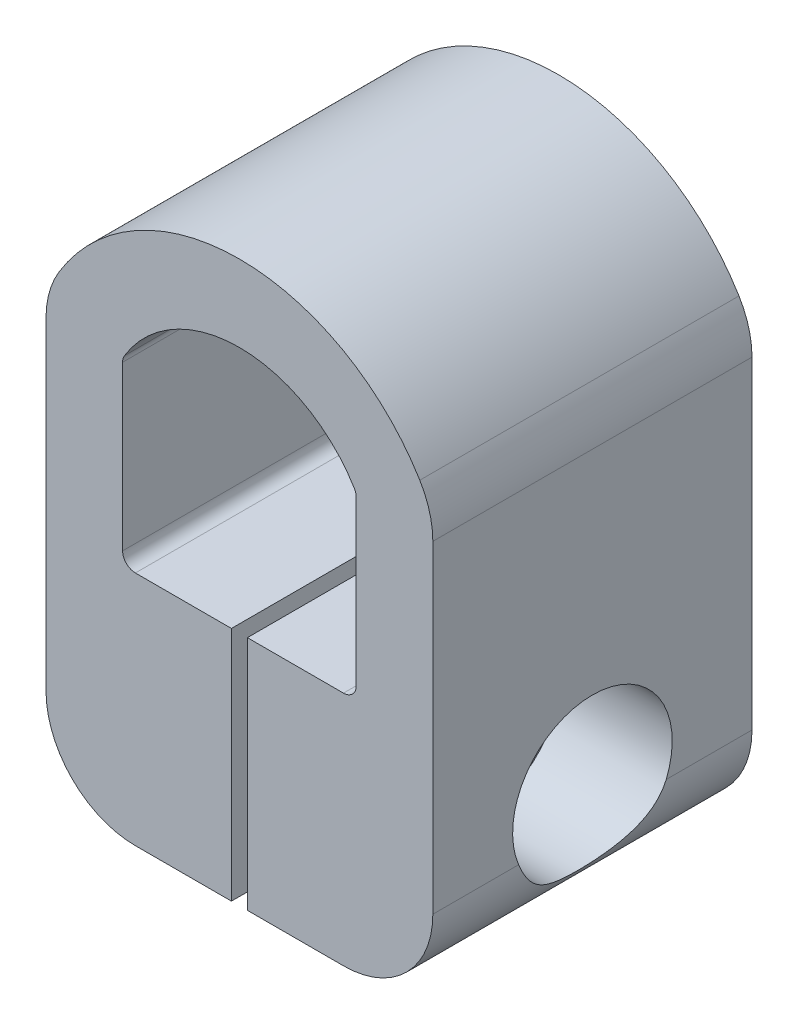
ISO-10303-21;
HEADER;
FILE_DESCRIPTION(('STEP AP214'),'2;1');
FILE_NAME('part.step','',(''),(''),'','','');
FILE_SCHEMA(('AUTOMOTIVE_DESIGN { 1 0 10303 214 1 1 1 1 }'));
ENDSEC;
DATA;
#1=APPLICATION_CONTEXT('core data for automotive mechanical design processes');
#2=APPLICATION_PROTOCOL_DEFINITION('international standard','automotive_design',2000,#1);
#3=PRODUCT_CONTEXT('',#1,'mechanical');
#4=PRODUCT('Part','Part','',(#3));
#5=PRODUCT_RELATED_PRODUCT_CATEGORY('part','',(#4));
#6=PRODUCT_DEFINITION_FORMATION('','',#4);
#7=PRODUCT_DEFINITION_CONTEXT('part definition',#1,'design');
#8=PRODUCT_DEFINITION('design','',#6,#7);
#9=PRODUCT_DEFINITION_SHAPE('','',#8);
#10=(LENGTH_UNIT() NAMED_UNIT(*) SI_UNIT(.MILLI.,.METRE.));
#11=(NAMED_UNIT(*) PLANE_ANGLE_UNIT() SI_UNIT($,.RADIAN.));
#12=(NAMED_UNIT(*) SI_UNIT($,.STERADIAN.) SOLID_ANGLE_UNIT());
#13=UNCERTAINTY_MEASURE_WITH_UNIT(LENGTH_MEASURE(1.E-05),#10,'distance_accuracy_value','');
#14=(GEOMETRIC_REPRESENTATION_CONTEXT(3) GLOBAL_UNCERTAINTY_ASSIGNED_CONTEXT((#13)) GLOBAL_UNIT_ASSIGNED_CONTEXT((#10,
#11,#12)) REPRESENTATION_CONTEXT('',''));
#15=CARTESIAN_POINT('',(0.,0.,0.));
#16=DIRECTION('',(0.,0.,1.));
#17=DIRECTION('',(1.,0.,0.));
#18=AXIS2_PLACEMENT_3D('',#15,#16,#17);
#19=CARTESIAN_POINT('',(0.,-19.05,25.4));
#20=DIRECTION('',(0.,1.,0.));
#21=DIRECTION('',(0.,0.,1.));
#22=AXIS2_PLACEMENT_3D('',#19,#20,#21);
#23=PLANE('',#22);
#24=DIRECTION('',(0.,0.,1.));
#25=VECTOR('',#24,1.);
#26=CARTESIAN_POINT('',(0.635000000000003,-19.05,0.));
#27=LINE('',#26,#25);
#28=CARTESIAN_POINT('',(0.635000000000003,-19.05,0.));
#29=VERTEX_POINT('',#28);
#30=CARTESIAN_POINT('',(0.635000000000003,-19.05,25.4));
#31=VERTEX_POINT('',#30);
#32=EDGE_CURVE('E358',#29,#31,#27,.T.);
#33=ORIENTED_EDGE('',*,*,#32,.F.);
#34=DIRECTION('',(1.,0.,0.));
#35=VECTOR('',#34,1.);
#36=CARTESIAN_POINT('',(0.,-19.05,0.));
#37=LINE('',#36,#35);
#38=CARTESIAN_POINT('',(8.2804,-19.05,0.));
#39=VERTEX_POINT('',#38);
#40=EDGE_CURVE('E209',#29,#39,#37,.T.);
#41=ORIENTED_EDGE('',*,*,#40,.T.);
#42=DIRECTION('',(0.,0.,-1.));
#43=VECTOR('',#42,1.);
#44=CARTESIAN_POINT('',(8.2804,-19.05,25.4));
#45=LINE('',#44,#43);
#46=CARTESIAN_POINT('',(8.2804,-19.05,25.4));
#47=VERTEX_POINT('',#46);
#48=EDGE_CURVE('E44',#47,#39,#45,.T.);
#49=ORIENTED_EDGE('',*,*,#48,.F.);
#50=DIRECTION('',(1.,0.,0.));
#51=VECTOR('',#50,1.);
#52=CARTESIAN_POINT('',(0.,-19.05,25.4));
#53=LINE('',#52,#51);
#54=EDGE_CURVE('E333',#31,#47,#53,.T.);
#55=ORIENTED_EDGE('',*,*,#54,.F.);
#56=EDGE_LOOP('',(#33,#41,#49,#55));
#57=FACE_BOUND('',#56,.T.);
#58=ADVANCED_FACE('F35',(#57),#23,.F.);
#59=CARTESIAN_POINT('',(0.,-0.254,25.4));
#60=DIRECTION('',(0.,1.,0.));
#61=DIRECTION('',(-1.,0.,0.));
#62=AXIS2_PLACEMENT_3D('',#59,#60,#61);
#63=PLANE('',#62);
#64=DIRECTION('',(1.,0.,0.));
#65=VECTOR('',#64,1.);
#66=CARTESIAN_POINT('',(0.,-0.254,0.));
#67=LINE('',#66,#65);
#68=CARTESIAN_POINT('',(0.635000000000003,-0.254,0.));
#69=VERTEX_POINT('',#68);
#70=CARTESIAN_POINT('',(8.2804,-0.254,0.));
#71=VERTEX_POINT('',#70);
#72=EDGE_CURVE('E200',#69,#71,#67,.T.);
#73=ORIENTED_EDGE('',*,*,#72,.F.);
#74=DIRECTION('',(0.,0.,1.));
#75=VECTOR('',#74,1.);
#76=CARTESIAN_POINT('',(0.635000000000003,-0.254,0.));
#77=LINE('',#76,#75);
#78=CARTESIAN_POINT('',(0.635000000000003,-0.254,25.4));
#79=VERTEX_POINT('',#78);
#80=EDGE_CURVE('E59',#69,#79,#77,.T.);
#81=ORIENTED_EDGE('',*,*,#80,.T.);
#82=DIRECTION('',(1.,0.,0.));
#83=VECTOR('',#82,1.);
#84=CARTESIAN_POINT('',(0.,-0.254,25.4));
#85=LINE('',#84,#83);
#86=CARTESIAN_POINT('',(8.2804,-0.254,25.4));
#87=VERTEX_POINT('',#86);
#88=EDGE_CURVE('E325',#79,#87,#85,.T.);
#89=ORIENTED_EDGE('',*,*,#88,.T.);
#90=DIRECTION('',(0.,0.,-1.));
#91=VECTOR('',#90,1.);
#92=CARTESIAN_POINT('',(8.2804,-0.254,25.4));
#93=LINE('',#92,#91);
#94=EDGE_CURVE('E260',#87,#71,#93,.T.);
#95=ORIENTED_EDGE('',*,*,#94,.T.);
#96=EDGE_LOOP('',(#73,#81,#89,#95));
#97=FACE_BOUND('',#96,.T.);
#98=ADVANCED_FACE('F389',(#97),#63,.T.);
#99=CARTESIAN_POINT('',(0.,0.,25.4));
#100=DIRECTION('',(0.,0.,1.));
#101=DIRECTION('',(1.,0.,0.));
#102=AXIS2_PLACEMENT_3D('',#99,#100,#101);
#103=PLANE('',#102);
#104=ORIENTED_EDGE('',*,*,#88,.F.);
#105=DIRECTION('',(0.,-1.,0.));
#106=VECTOR('',#105,1.);
#107=CARTESIAN_POINT('',(0.635000000000002,0.,25.4));
#108=LINE('',#107,#106);
#109=EDGE_CURVE('E455',#79,#31,#108,.T.);
#110=ORIENTED_EDGE('',*,*,#109,.T.);
#111=ORIENTED_EDGE('',*,*,#54,.T.);
#112=CARTESIAN_POINT('',(8.2804,-11.938,25.4));
#113=DIRECTION('',(0.,0.,1.));
#114=DIRECTION('',(1.,0.,0.));
#115=AXIS2_PLACEMENT_3D('',#112,#113,#114);
#116=CIRCLE('',#115,7.112);
#117=CARTESIAN_POINT('',(15.3924,-11.938,25.4));
#118=VERTEX_POINT('',#117);
#119=EDGE_CURVE('E337',#47,#118,#116,.T.);
#120=ORIENTED_EDGE('',*,*,#119,.T.);
#121=DIRECTION('',(0.,1.,0.));
#122=VECTOR('',#121,1.);
#123=CARTESIAN_POINT('',(15.3924,0.,25.4));
#124=LINE('',#123,#122);
#125=CARTESIAN_POINT('',(15.3924,13.7607257458803,25.4));
#126=VERTEX_POINT('',#125);
#127=EDGE_CURVE('E339',#118,#126,#124,.T.);
#128=ORIENTED_EDGE('',*,*,#127,.T.);
#129=CARTESIAN_POINT('',(8.2804,13.7607257458803,25.4));
#130=DIRECTION('',(0.,0.,1.));
#131=DIRECTION('',(1.,0.,0.));
#132=AXIS2_PLACEMENT_3D('',#129,#130,#131);
#133=CIRCLE('',#132,7.112);
#134=CARTESIAN_POINT('',(14.3559710368718,17.4577489505579,25.4));
#135=VERTEX_POINT('',#134);
#136=EDGE_CURVE('E341',#126,#135,#133,.T.);
#137=ORIENTED_EDGE('',*,*,#136,.T.);
#138=CARTESIAN_POINT('',(0.,8.72205024390244,25.4));
#139=DIRECTION('',(0.,0.,1.));
#140=DIRECTION('',(1.,0.,0.));
#141=AXIS2_PLACEMENT_3D('',#138,#139,#140);
#142=CIRCLE('',#141,16.8049497560976);
#143=CARTESIAN_POINT('',(-14.3559710368718,17.4577489505579,25.4));
#144=VERTEX_POINT('',#143);
#145=EDGE_CURVE('E343',#135,#144,#142,.T.);
#146=ORIENTED_EDGE('',*,*,#145,.T.);
#147=CARTESIAN_POINT('',(-8.28039999999999,13.7607257458803,25.4));
#148=DIRECTION('',(0.,0.,1.));
#149=DIRECTION('',(1.,0.,0.));
#150=AXIS2_PLACEMENT_3D('',#147,#148,#149);
#151=CIRCLE('',#150,7.112);
#152=CARTESIAN_POINT('',(-15.3924,13.7607257458803,25.4));
#153=VERTEX_POINT('',#152);
#154=EDGE_CURVE('E345',#144,#153,#151,.T.);
#155=ORIENTED_EDGE('',*,*,#154,.T.);
#156=DIRECTION('',(0.,-1.,0.));
#157=VECTOR('',#156,1.);
#158=CARTESIAN_POINT('',(-15.3924,0.,25.4));
#159=LINE('',#158,#157);
#160=CARTESIAN_POINT('',(-15.3924,-11.938,25.4));
#161=VERTEX_POINT('',#160);
#162=EDGE_CURVE('E347',#153,#161,#159,.T.);
#163=ORIENTED_EDGE('',*,*,#162,.T.);
#164=CARTESIAN_POINT('',(-8.2804,-11.938,25.4));
#165=DIRECTION('',(0.,0.,1.));
#166=DIRECTION('',(1.,0.,0.));
#167=AXIS2_PLACEMENT_3D('',#164,#165,#166);
#168=CIRCLE('',#167,7.112);
#169=CARTESIAN_POINT('',(-8.2804,-19.05,25.4));
#170=VERTEX_POINT('',#169);
#171=EDGE_CURVE('E256',#161,#170,#168,.T.);
#172=ORIENTED_EDGE('',*,*,#171,.T.);
#173=CARTESIAN_POINT('',(-0.634999999999997,-19.05,25.4));
#174=VERTEX_POINT('',#173);
#175=EDGE_CURVE('E334',#170,#174,#53,.T.);
#176=ORIENTED_EDGE('',*,*,#175,.T.);
#177=DIRECTION('',(0.,-1.,0.));
#178=VECTOR('',#177,1.);
#179=CARTESIAN_POINT('',(-0.634999999999998,0.,25.4));
#180=LINE('',#179,#178);
#181=CARTESIAN_POINT('',(-0.634999999999998,-0.254,25.4));
#182=VERTEX_POINT('',#181);
#183=EDGE_CURVE('E458',#182,#174,#180,.T.);
#184=ORIENTED_EDGE('',*,*,#183,.F.);
#185=CARTESIAN_POINT('',(-8.2804,-0.254,25.4));
#186=VERTEX_POINT('',#185);
#187=EDGE_CURVE('E194',#186,#182,#85,.T.);
#188=ORIENTED_EDGE('',*,*,#187,.F.);
#189=CARTESIAN_POINT('',(-8.2804,0.762,25.4));
#190=DIRECTION('',(0.,0.,1.));
#191=DIRECTION('',(1.,0.,0.));
#192=AXIS2_PLACEMENT_3D('',#189,#190,#191);
#193=CIRCLE('',#192,1.016);
#194=CARTESIAN_POINT('',(-9.2964,0.762000000000001,25.4));
#195=VERTEX_POINT('',#194);
#196=EDGE_CURVE('E327',#195,#186,#193,.T.);
#197=ORIENTED_EDGE('',*,*,#196,.F.);
#198=DIRECTION('',(0.,-1.,0.));
#199=VECTOR('',#198,1.);
#200=CARTESIAN_POINT('',(-9.2964,0.,25.4));
#201=LINE('',#200,#199);
#202=CARTESIAN_POINT('',(-9.2964,13.7607257458803,25.4));
#203=VERTEX_POINT('',#202);
#204=EDGE_CURVE('E330',#203,#195,#201,.T.);
#205=ORIENTED_EDGE('',*,*,#204,.F.);
#206=CARTESIAN_POINT('',(-8.28039999999999,13.7607257458803,25.4));
#207=DIRECTION('',(0.,0.,1.));
#208=DIRECTION('',(1.,0.,0.));
#209=AXIS2_PLACEMENT_3D('',#206,#207,#208);
#210=CIRCLE('',#209,1.016);
#211=CARTESIAN_POINT('',(-9.14833871955311,14.2888719179771,25.4));
#212=VERTEX_POINT('',#211);
#213=EDGE_CURVE('E227',#212,#203,#210,.T.);
#214=ORIENTED_EDGE('',*,*,#213,.F.);
#215=CARTESIAN_POINT('',(0.,8.72205024390244,25.4));
#216=DIRECTION('',(0.,0.,1.));
#217=DIRECTION('',(1.,0.,0.));
#218=AXIS2_PLACEMENT_3D('',#215,#216,#217);
#219=CIRCLE('',#218,10.7089497560976);
#220=CARTESIAN_POINT('',(9.14833871955311,14.2888719179771,25.4));
#221=VERTEX_POINT('',#220);
#222=EDGE_CURVE('E278',#221,#212,#219,.T.);
#223=ORIENTED_EDGE('',*,*,#222,.F.);
#224=CARTESIAN_POINT('',(8.2804,13.7607257458803,25.4));
#225=DIRECTION('',(0.,0.,1.));
#226=DIRECTION('',(1.,0.,0.));
#227=AXIS2_PLACEMENT_3D('',#224,#225,#226);
#228=CIRCLE('',#227,1.016);
#229=CARTESIAN_POINT('',(9.2964,13.7607257458803,25.4));
#230=VERTEX_POINT('',#229);
#231=EDGE_CURVE('E313',#230,#221,#228,.T.);
#232=ORIENTED_EDGE('',*,*,#231,.F.);
#233=DIRECTION('',(0.,1.,0.));
#234=VECTOR('',#233,1.);
#235=CARTESIAN_POINT('',(9.2964,0.,25.4));
#236=LINE('',#235,#234);
#237=CARTESIAN_POINT('',(9.2964,0.762,25.4));
#238=VERTEX_POINT('',#237);
#239=EDGE_CURVE('E308',#238,#230,#236,.T.);
#240=ORIENTED_EDGE('',*,*,#239,.F.);
#241=CARTESIAN_POINT('',(8.2804,0.762,25.4));
#242=DIRECTION('',(0.,0.,1.));
#243=DIRECTION('',(1.,0.,0.));
#244=AXIS2_PLACEMENT_3D('',#241,#242,#243);
#245=CIRCLE('',#244,1.016);
#246=EDGE_CURVE('E303',#87,#238,#245,.T.);
#247=ORIENTED_EDGE('',*,*,#246,.F.);
#248=EDGE_LOOP('',(#104,#110,#111,#120,#128,#137,#146,#155,#163,#172,#176,#184,#188,#197,#205,
#214,#223,#232,#240,#247));
#249=FACE_BOUND('',#248,.T.);
#250=ADVANCED_FACE('F316',(#249),#103,.T.);
#251=CARTESIAN_POINT('',(0.,0.,0.));
#252=DIRECTION('',(0.,0.,1.));
#253=DIRECTION('',(1.,0.,0.));
#254=AXIS2_PLACEMENT_3D('',#251,#252,#253);
#255=PLANE('',#254);
#256=DIRECTION('',(0.,-1.,0.));
#257=VECTOR('',#256,1.);
#258=CARTESIAN_POINT('',(0.635000000000002,0.,0.));
#259=LINE('',#258,#257);
#260=EDGE_CURVE('E185',#69,#29,#259,.T.);
#261=ORIENTED_EDGE('',*,*,#260,.F.);
#262=ORIENTED_EDGE('',*,*,#72,.T.);
#263=CARTESIAN_POINT('',(8.2804,0.762,0.));
#264=DIRECTION('',(0.,0.,1.));
#265=DIRECTION('',(1.,0.,0.));
#266=AXIS2_PLACEMENT_3D('',#263,#264,#265);
#267=CIRCLE('',#266,1.016);
#268=CARTESIAN_POINT('',(9.2964,0.762,0.));
#269=VERTEX_POINT('',#268);
#270=EDGE_CURVE('E204',#71,#269,#267,.T.);
#271=ORIENTED_EDGE('',*,*,#270,.T.);
#272=DIRECTION('',(0.,1.,0.));
#273=VECTOR('',#272,1.);
#274=CARTESIAN_POINT('',(9.2964,0.,0.));
#275=LINE('',#274,#273);
#276=CARTESIAN_POINT('',(9.2964,13.7607257458803,0.));
#277=VERTEX_POINT('',#276);
#278=EDGE_CURVE('E291',#269,#277,#275,.T.);
#279=ORIENTED_EDGE('',*,*,#278,.T.);
#280=CARTESIAN_POINT('',(8.2804,13.7607257458803,0.));
#281=DIRECTION('',(0.,0.,1.));
#282=DIRECTION('',(1.,0.,0.));
#283=AXIS2_PLACEMENT_3D('',#280,#281,#282);
#284=CIRCLE('',#283,1.016);
#285=CARTESIAN_POINT('',(9.14833871955311,14.2888719179771,0.));
#286=VERTEX_POINT('',#285);
#287=EDGE_CURVE('E289',#277,#286,#284,.T.);
#288=ORIENTED_EDGE('',*,*,#287,.T.);
#289=CARTESIAN_POINT('',(0.,8.72205024390244,0.));
#290=DIRECTION('',(0.,0.,1.));
#291=DIRECTION('',(1.,0.,0.));
#292=AXIS2_PLACEMENT_3D('',#289,#290,#291);
#293=CIRCLE('',#292,10.7089497560976);
#294=CARTESIAN_POINT('',(-9.14833871955311,14.2888719179771,0.));
#295=VERTEX_POINT('',#294);
#296=EDGE_CURVE('E275',#286,#295,#293,.T.);
#297=ORIENTED_EDGE('',*,*,#296,.T.);
#298=CARTESIAN_POINT('',(-8.28039999999999,13.7607257458803,0.));
#299=DIRECTION('',(0.,0.,1.));
#300=DIRECTION('',(1.,0.,0.));
#301=AXIS2_PLACEMENT_3D('',#298,#299,#300);
#302=CIRCLE('',#301,1.016);
#303=CARTESIAN_POINT('',(-9.2964,13.7607257458803,0.));
#304=VERTEX_POINT('',#303);
#305=EDGE_CURVE('E283',#295,#304,#302,.T.);
#306=ORIENTED_EDGE('',*,*,#305,.T.);
#307=DIRECTION('',(0.,-1.,0.));
#308=VECTOR('',#307,1.);
#309=CARTESIAN_POINT('',(-9.2964,0.,0.));
#310=LINE('',#309,#308);
#311=CARTESIAN_POINT('',(-9.2964,0.762000000000001,0.));
#312=VERTEX_POINT('',#311);
#313=EDGE_CURVE('E202',#304,#312,#310,.T.);
#314=ORIENTED_EDGE('',*,*,#313,.T.);
#315=CARTESIAN_POINT('',(-8.2804,0.762,0.));
#316=DIRECTION('',(0.,0.,1.));
#317=DIRECTION('',(1.,0.,0.));
#318=AXIS2_PLACEMENT_3D('',#315,#316,#317);
#319=CIRCLE('',#318,1.016);
#320=CARTESIAN_POINT('',(-8.2804,-0.254,0.));
#321=VERTEX_POINT('',#320);
#322=EDGE_CURVE('E199',#312,#321,#319,.T.);
#323=ORIENTED_EDGE('',*,*,#322,.T.);
#324=CARTESIAN_POINT('',(-0.634999999999998,-0.254,0.));
#325=VERTEX_POINT('',#324);
#326=EDGE_CURVE('E191',#321,#325,#67,.T.);
#327=ORIENTED_EDGE('',*,*,#326,.T.);
#328=DIRECTION('',(0.,-1.,0.));
#329=VECTOR('',#328,1.);
#330=CARTESIAN_POINT('',(-0.634999999999998,0.,0.));
#331=LINE('',#330,#329);
#332=CARTESIAN_POINT('',(-0.634999999999997,-19.05,0.));
#333=VERTEX_POINT('',#332);
#334=EDGE_CURVE('E176',#325,#333,#331,.T.);
#335=ORIENTED_EDGE('',*,*,#334,.T.);
#336=CARTESIAN_POINT('',(-8.2804,-19.05,0.));
#337=VERTEX_POINT('',#336);
#338=EDGE_CURVE('E210',#337,#333,#37,.T.);
#339=ORIENTED_EDGE('',*,*,#338,.F.);
#340=CARTESIAN_POINT('',(-8.2804,-11.938,0.));
#341=DIRECTION('',(0.,0.,1.));
#342=DIRECTION('',(1.,0.,0.));
#343=AXIS2_PLACEMENT_3D('',#340,#341,#342);
#344=CIRCLE('',#343,7.112);
#345=CARTESIAN_POINT('',(-15.3924,-11.938,0.));
#346=VERTEX_POINT('',#345);
#347=EDGE_CURVE('E225',#346,#337,#344,.T.);
#348=ORIENTED_EDGE('',*,*,#347,.F.);
#349=DIRECTION('',(0.,-1.,0.));
#350=VECTOR('',#349,1.);
#351=CARTESIAN_POINT('',(-15.3924,0.,0.));
#352=LINE('',#351,#350);
#353=CARTESIAN_POINT('',(-15.3924,13.7607257458803,0.));
#354=VERTEX_POINT('',#353);
#355=EDGE_CURVE('E223',#354,#346,#352,.T.);
#356=ORIENTED_EDGE('',*,*,#355,.F.);
#357=CARTESIAN_POINT('',(-8.28039999999999,13.7607257458803,0.));
#358=DIRECTION('',(0.,0.,1.));
#359=DIRECTION('',(1.,0.,0.));
#360=AXIS2_PLACEMENT_3D('',#357,#358,#359);
#361=CIRCLE('',#360,7.112);
#362=CARTESIAN_POINT('',(-14.3559710368718,17.4577489505579,0.));
#363=VERTEX_POINT('',#362);
#364=EDGE_CURVE('E221',#363,#354,#361,.T.);
#365=ORIENTED_EDGE('',*,*,#364,.F.);
#366=CARTESIAN_POINT('',(0.,8.72205024390244,0.));
#367=DIRECTION('',(0.,0.,1.));
#368=DIRECTION('',(1.,0.,0.));
#369=AXIS2_PLACEMENT_3D('',#366,#367,#368);
#370=CIRCLE('',#369,16.8049497560976);
#371=CARTESIAN_POINT('',(14.3559710368718,17.4577489505579,0.));
#372=VERTEX_POINT('',#371);
#373=EDGE_CURVE('E219',#372,#363,#370,.T.);
#374=ORIENTED_EDGE('',*,*,#373,.F.);
#375=CARTESIAN_POINT('',(8.2804,13.7607257458803,0.));
#376=DIRECTION('',(0.,0.,1.));
#377=DIRECTION('',(1.,0.,0.));
#378=AXIS2_PLACEMENT_3D('',#375,#376,#377);
#379=CIRCLE('',#378,7.112);
#380=CARTESIAN_POINT('',(15.3924,13.7607257458803,0.));
#381=VERTEX_POINT('',#380);
#382=EDGE_CURVE('E217',#381,#372,#379,.T.);
#383=ORIENTED_EDGE('',*,*,#382,.F.);
#384=DIRECTION('',(0.,1.,0.));
#385=VECTOR('',#384,1.);
#386=CARTESIAN_POINT('',(15.3924,0.,0.));
#387=LINE('',#386,#385);
#388=CARTESIAN_POINT('',(15.3924,-11.938,0.));
#389=VERTEX_POINT('',#388);
#390=EDGE_CURVE('E215',#389,#381,#387,.T.);
#391=ORIENTED_EDGE('',*,*,#390,.F.);
#392=CARTESIAN_POINT('',(8.2804,-11.938,0.));
#393=DIRECTION('',(0.,0.,1.));
#394=DIRECTION('',(1.,0.,0.));
#395=AXIS2_PLACEMENT_3D('',#392,#393,#394);
#396=CIRCLE('',#395,7.112);
#397=EDGE_CURVE('E212',#39,#389,#396,.T.);
#398=ORIENTED_EDGE('',*,*,#397,.F.);
#399=ORIENTED_EDGE('',*,*,#40,.F.);
#400=EDGE_LOOP('',(#261,#262,#271,#279,#288,#297,#306,#314,#323,#327,#335,#339,#348,#356,#365,
#374,#383,#391,#398,#399));
#401=FACE_BOUND('',#400,.T.);
#402=ADVANCED_FACE('F196',(#401),#255,.F.);
#403=CARTESIAN_POINT('',(0.152400000000002,-9.525,12.7));
#404=DIRECTION('',(1.,0.,0.));
#405=DIRECTION('',(0.,1.,0.));
#406=AXIS2_PLACEMENT_3D('',#403,#404,#405);
#407=CYLINDRICAL_SURFACE('',#406,3.175);
#408=CARTESIAN_POINT('',(6.5024,-9.525,12.7));
#409=DIRECTION('',(1.,0.,0.));
#410=DIRECTION('',(0.,1.,0.));
#411=AXIS2_PLACEMENT_3D('',#408,#409,#410);
#412=CIRCLE('',#411,3.175);
#413=CARTESIAN_POINT('',(6.5024,-6.35,12.7));
#414=VERTEX_POINT('',#413);
#415=EDGE_CURVE('E364',#414,#414,#412,.T.);
#416=ORIENTED_EDGE('',*,*,#415,.T.);
#417=EDGE_LOOP('',(#416));
#418=FACE_BOUND('',#417,.T.);
#419=CARTESIAN_POINT('',(0.635000000000003,-9.525,12.7));
#420=DIRECTION('',(-1.,0.,0.));
#421=DIRECTION('',(0.,-1.,0.));
#422=AXIS2_PLACEMENT_3D('',#419,#420,#421);
#423=CIRCLE('',#422,3.175);
#424=CARTESIAN_POINT('',(0.635000000000003,-12.7,12.7));
#425=VERTEX_POINT('',#424);
#426=EDGE_CURVE('E39',#425,#425,#423,.F.);
#427=ORIENTED_EDGE('',*,*,#426,.F.);
#428=EDGE_LOOP('',(#427));
#429=FACE_BOUND('',#428,.T.);
#430=ADVANCED_FACE('F392',(#418,#429),#407,.F.);
#431=ORIENTED_EDGE('',*,*,#338,.T.);
#432=DIRECTION('',(0.,0.,1.));
#433=VECTOR('',#432,1.);
#434=CARTESIAN_POINT('',(-0.634999999999997,-19.05,0.));
#435=LINE('',#434,#433);
#436=EDGE_CURVE('E51',#333,#174,#435,.T.);
#437=ORIENTED_EDGE('',*,*,#436,.T.);
#438=ORIENTED_EDGE('',*,*,#175,.F.);
#439=DIRECTION('',(0.,0.,-1.));
#440=VECTOR('',#439,1.);
#441=CARTESIAN_POINT('',(-8.2804,-19.05,25.4));
#442=LINE('',#441,#440);
#443=EDGE_CURVE('E228',#170,#337,#442,.T.);
#444=ORIENTED_EDGE('',*,*,#443,.T.);
#445=EDGE_LOOP('',(#431,#437,#438,#444));
#446=FACE_BOUND('',#445,.T.);
#447=ADVANCED_FACE('F357',(#446),#23,.F.);
#448=CARTESIAN_POINT('',(8.2804,-11.938,25.4));
#449=DIRECTION('',(0.,0.,-1.));
#450=DIRECTION('',(-1.,0.,0.));
#451=AXIS2_PLACEMENT_3D('',#448,#449,#450);
#452=CYLINDRICAL_SURFACE('',#451,7.112);
#453=DIRECTION('',(0.,0.,-1.));
#454=VECTOR('',#453,1.);
#455=CARTESIAN_POINT('',(15.3924,-11.938,25.4));
#456=LINE('',#455,#454);
#457=CARTESIAN_POINT('',(15.3924,-11.938,6.82633581143763));
#458=VERTEX_POINT('',#457);
#459=EDGE_CURVE('E247',#458,#389,#456,.T.);
#460=ORIENTED_EDGE('',*,*,#459,.F.);
#461=CARTESIAN_POINT('',(15.3924,-11.938,6.82633581143763));
#462=CARTESIAN_POINT('',(15.3924278064319,-12.0918523638487,6.88950421975895));
#463=CARTESIAN_POINT('',(15.387409338751,-12.2431194439231,6.95874616505039));
#464=CARTESIAN_POINT('',(15.3684892961368,-12.5391647591403,7.10851726617109));
#465=CARTESIAN_POINT('',(15.3545984124505,-12.6839505798002,7.18903274636085));
#466=CARTESIAN_POINT('',(15.3192687286385,-12.965044763054,7.36001054665285));
#467=CARTESIAN_POINT('',(15.2978866522844,-13.1014080190008,7.45039469519593));
#468=CARTESIAN_POINT('',(15.2488555240133,-13.3660389616524,7.6407993458642));
#469=CARTESIAN_POINT('',(15.2212046787058,-13.4943043182316,7.7408226008606));
#470=CARTESIAN_POINT('',(15.1311086240926,-13.864824878252,8.05323981684156));
#471=CARTESIAN_POINT('',(15.0613062525486,-14.0942966907045,8.27889665982908));
#472=CARTESIAN_POINT('',(14.9125179077233,-14.515936057594,8.76096271313372));
#473=CARTESIAN_POINT('',(14.8335074558927,-14.7080003785046,9.01745395263454));
#474=CARTESIAN_POINT('',(14.7118624217837,-14.9757558772031,9.43753959889212));
#475=CARTESIAN_POINT('',(14.6685558267893,-15.0654088367384,9.59220397132654));
#476=CARTESIAN_POINT('',(14.5844587927273,-15.231639679938,9.90916062202048));
#477=CARTESIAN_POINT('',(14.5436689424184,-15.3082145115017,10.0714546696122));
#478=CARTESIAN_POINT('',(14.4666391003129,-15.4476056523254,10.402718057865));
#479=CARTESIAN_POINT('',(14.4303950092508,-15.5104343961316,10.5716812010256));
#480=CARTESIAN_POINT('',(14.364373439256,-15.621748622879,10.9154102234089));
#481=CARTESIAN_POINT('',(14.3345920630634,-15.6702427565553,11.0901725317908));
#482=CARTESIAN_POINT('',(14.2838525606623,-15.7513111034274,11.4402153697173));
#483=CARTESIAN_POINT('',(14.2627035795267,-15.7842325717654,11.6153872611309));
#484=CARTESIAN_POINT('',(14.2295759232313,-15.8352790922104,11.9687447562726));
#485=CARTESIAN_POINT('',(14.2175968313884,-15.8534048166437,12.1469302226867));
#486=CARTESIAN_POINT('',(14.20362483192,-15.8745104887286,12.5044286484672));
#487=CARTESIAN_POINT('',(14.2016227580822,-15.8775043385635,12.6837404213214));
#488=CARTESIAN_POINT('',(14.2077212003933,-15.8683229861276,13.0417876763356));
#489=CARTESIAN_POINT('',(14.2158207084702,-15.8561492974784,13.2205232142158));
#490=CARTESIAN_POINT('',(14.2395753335872,-15.819900671989,13.5482773118067));
#491=CARTESIAN_POINT('',(14.2538755016888,-15.7979461441725,13.6976351648427));
#492=CARTESIAN_POINT('',(14.2886205920009,-15.7436350289891,13.993739926699));
#493=CARTESIAN_POINT('',(14.3090675212578,-15.7112750437818,14.1404859661051));
#494=CARTESIAN_POINT('',(14.3783446795227,-15.5990684880449,14.5755775802769));
#495=CARTESIAN_POINT('',(14.4351206011978,-15.5040824783747,14.8588898893711));
#496=CARTESIAN_POINT('',(14.5659529133129,-15.2684274437081,15.4271391125094));
#497=CARTESIAN_POINT('',(14.6409779352909,-15.1248952331144,15.7106412754559));
#498=CARTESIAN_POINT('',(14.7947102138734,-14.797544302959,16.2528988058821));
#499=CARTESIAN_POINT('',(14.8734221213599,-14.6136735591548,16.5116215908618));
#500=CARTESIAN_POINT('',(14.9918632421895,-14.2943414828497,16.8963467667113));
#501=CARTESIAN_POINT('',(15.0339817672683,-14.1713668678904,17.0321452984248));
#502=CARTESIAN_POINT('',(15.1138997788655,-13.9133610934083,17.2933065475826));
#503=CARTESIAN_POINT('',(15.1516981485015,-13.7783268321267,17.4186665641117));
#504=CARTESIAN_POINT('',(15.2208586595244,-13.4973128608743,17.6575337188103));
#505=CARTESIAN_POINT('',(15.2522392811446,-13.3513662794531,17.7710744141363));
#506=CARTESIAN_POINT('',(15.3067383144226,-13.0491534837355,17.9855591727313));
#507=CARTESIAN_POINT('',(15.329862918987,-12.8928951090911,18.0865126406339));
#508=CARTESIAN_POINT('',(15.3622157505983,-12.6049232542598,18.2550214009993));
#509=CARTESIAN_POINT('',(15.3733398037189,-12.4749207817561,18.3251438368952));
#510=CARTESIAN_POINT('',(15.3884420300292,-12.2099617922263,18.4563366661853));
#511=CARTESIAN_POINT('',(15.3924170439522,-12.0750031118472,18.5174030466421));
#512=CARTESIAN_POINT('',(15.3924,-11.938,18.5736641885624));
#513=B_SPLINE_CURVE_WITH_KNOTS('',3,(#461,#462,#463,#464,#465,#466,#467,#468,#469,#470,#471,
#472,#473,#474,#475,#476,#477,#478,#479,#480,#481,#482,#483,#484,#485,#486,#487,#488,#489,#490,
#491,#492,#493,#494,#495,#496,#497,#498,#499,#500,#501,#502,#503,#504,#505,#506,#507,#508,#509,
#510,#511,#512),.UNSPECIFIED.,.F.,.F.,(4,2,2,2,2,2,2,2,2,2,2,2,2,2,2,2,2,2,2,2,2,2,2,2,2,4),(0.,
0.498615840775297,0.996631980878007,1.49095583102689,1.98542127787313,2.96912640659501,
3.95550895395703,4.50678684953187,5.05819322398872,5.60909872139863,6.15967107314651,
6.69730828846828,7.23492107191482,7.77203984176881,8.30910501496504,8.76349970848244,
9.21804293283392,10.1267902677042,11.1028649780523,12.080206001903,12.6435477633205,
13.2070348366578,13.7688757362031,14.3302943043965,14.7741650714247,15.2182319433907),.UNSPECIFIED.);
#514=CARTESIAN_POINT('',(15.3924,-11.938,18.5736641885624));
#515=VERTEX_POINT('',#514);
#516=EDGE_CURVE('E285',#458,#515,#513,.T.);
#517=ORIENTED_EDGE('',*,*,#516,.T.);
#518=EDGE_CURVE('E248',#118,#515,#456,.T.);
#519=ORIENTED_EDGE('',*,*,#518,.F.);
#520=ORIENTED_EDGE('',*,*,#119,.F.);
#521=ORIENTED_EDGE('',*,*,#48,.T.);
#522=ORIENTED_EDGE('',*,*,#397,.T.);
#523=EDGE_LOOP('',(#460,#517,#519,#520,#521,#522));
#524=FACE_BOUND('',#523,.T.);
#525=ADVANCED_FACE('F375',(#524),#452,.T.);
#526=CARTESIAN_POINT('',(15.3924,0.,25.4));
#527=DIRECTION('',(-1.,0.,0.));
#528=DIRECTION('',(0.,-1.,0.));
#529=AXIS2_PLACEMENT_3D('',#526,#527,#528);
#530=PLANE('',#529);
#531=ORIENTED_EDGE('',*,*,#518,.T.);
#532=CARTESIAN_POINT('',(15.3924,-9.525,12.7));
#533=DIRECTION('',(-1.,0.,0.));
#534=DIRECTION('',(0.,-1.,0.));
#535=AXIS2_PLACEMENT_3D('',#532,#533,#534);
#536=CIRCLE('',#535,6.35);
#537=EDGE_CURVE('E11',#515,#458,#536,.T.);
#538=ORIENTED_EDGE('',*,*,#537,.T.);
#539=ORIENTED_EDGE('',*,*,#459,.T.);
#540=ORIENTED_EDGE('',*,*,#390,.T.);
#541=DIRECTION('',(0.,0.,-1.));
#542=VECTOR('',#541,1.);
#543=CARTESIAN_POINT('',(15.3924,13.7607257458803,25.4));
#544=LINE('',#543,#542);
#545=EDGE_CURVE('E244',#126,#381,#544,.T.);
#546=ORIENTED_EDGE('',*,*,#545,.F.);
#547=ORIENTED_EDGE('',*,*,#127,.F.);
#548=EDGE_LOOP('',(#531,#538,#539,#540,#546,#547));
#549=FACE_BOUND('',#548,.T.);
#550=ADVANCED_FACE('F410',(#549),#530,.F.);
#551=CARTESIAN_POINT('',(8.2804,13.7607257458803,25.4));
#552=DIRECTION('',(0.,0.,-1.));
#553=DIRECTION('',(-1.,0.,0.));
#554=AXIS2_PLACEMENT_3D('',#551,#552,#553);
#555=CYLINDRICAL_SURFACE('',#554,7.112);
#556=ORIENTED_EDGE('',*,*,#382,.T.);
#557=DIRECTION('',(0.,0.,-1.));
#558=VECTOR('',#557,1.);
#559=CARTESIAN_POINT('',(14.3559710368718,17.4577489505579,25.4));
#560=LINE('',#559,#558);
#561=EDGE_CURVE('E241',#135,#372,#560,.T.);
#562=ORIENTED_EDGE('',*,*,#561,.F.);
#563=ORIENTED_EDGE('',*,*,#136,.F.);
#564=ORIENTED_EDGE('',*,*,#545,.T.);
#565=EDGE_LOOP('',(#556,#562,#563,#564));
#566=FACE_BOUND('',#565,.T.);
#567=ADVANCED_FACE('F407',(#566),#555,.T.);
#568=CARTESIAN_POINT('',(0.,8.72205024390244,25.4));
#569=DIRECTION('',(0.,0.,-1.));
#570=DIRECTION('',(-1.,0.,0.));
#571=AXIS2_PLACEMENT_3D('',#568,#569,#570);
#572=CYLINDRICAL_SURFACE('',#571,16.8049497560976);
#573=ORIENTED_EDGE('',*,*,#373,.T.);
#574=DIRECTION('',(0.,0.,-1.));
#575=VECTOR('',#574,1.);
#576=CARTESIAN_POINT('',(-14.3559710368718,17.4577489505579,25.4));
#577=LINE('',#576,#575);
#578=EDGE_CURVE('E238',#144,#363,#577,.T.);
#579=ORIENTED_EDGE('',*,*,#578,.F.);
#580=ORIENTED_EDGE('',*,*,#145,.F.);
#581=ORIENTED_EDGE('',*,*,#561,.T.);
#582=EDGE_LOOP('',(#573,#579,#580,#581));
#583=FACE_BOUND('',#582,.T.);
#584=ADVANCED_FACE('F403',(#583),#572,.T.);
#585=CARTESIAN_POINT('',(-8.28039999999999,13.7607257458803,25.4));
#586=DIRECTION('',(0.,0.,-1.));
#587=DIRECTION('',(-1.,0.,0.));
#588=AXIS2_PLACEMENT_3D('',#585,#586,#587);
#589=CYLINDRICAL_SURFACE('',#588,7.112);
#590=ORIENTED_EDGE('',*,*,#364,.T.);
#591=DIRECTION('',(0.,0.,-1.));
#592=VECTOR('',#591,1.);
#593=CARTESIAN_POINT('',(-15.3924,13.7607257458803,25.4));
#594=LINE('',#593,#592);
#595=EDGE_CURVE('E235',#153,#354,#594,.T.);
#596=ORIENTED_EDGE('',*,*,#595,.F.);
#597=ORIENTED_EDGE('',*,*,#154,.F.);
#598=ORIENTED_EDGE('',*,*,#578,.T.);
#599=EDGE_LOOP('',(#590,#596,#597,#598));
#600=FACE_BOUND('',#599,.T.);
#601=ADVANCED_FACE('F399',(#600),#589,.T.);
#602=CARTESIAN_POINT('',(-15.3924,0.,25.4));
#603=DIRECTION('',(1.,0.,0.));
#604=DIRECTION('',(0.,0.,-1.));
#605=AXIS2_PLACEMENT_3D('',#602,#603,#604);
#606=PLANE('',#605);
#607=CARTESIAN_POINT('',(-15.3924,-9.525,12.7));
#608=DIRECTION('',(1.,0.,0.));
#609=DIRECTION('',(0.,1.,0.));
#610=AXIS2_PLACEMENT_3D('',#607,#608,#609);
#611=CIRCLE('',#610,1.905);
#612=CARTESIAN_POINT('',(-15.3924,-7.62,12.7));
#613=VERTEX_POINT('',#612);
#614=EDGE_CURVE('E450',#613,#613,#611,.T.);
#615=ORIENTED_EDGE('',*,*,#614,.T.);
#616=EDGE_LOOP('',(#615));
#617=FACE_BOUND('',#616,.T.);
#618=ORIENTED_EDGE('',*,*,#355,.T.);
#619=DIRECTION('',(0.,0.,-1.));
#620=VECTOR('',#619,1.);
#621=CARTESIAN_POINT('',(-15.3924,-11.938,25.4));
#622=LINE('',#621,#620);
#623=EDGE_CURVE('E231',#161,#346,#622,.T.);
#624=ORIENTED_EDGE('',*,*,#623,.F.);
#625=ORIENTED_EDGE('',*,*,#162,.F.);
#626=ORIENTED_EDGE('',*,*,#595,.T.);
#627=EDGE_LOOP('',(#618,#624,#625,#626));
#628=FACE_BOUND('',#627,.T.);
#629=ADVANCED_FACE('F396',(#617,#628),#606,.F.);
#630=CARTESIAN_POINT('',(-8.28039999999999,13.7607257458803,25.4));
#631=DIRECTION('',(0.,0.,-1.));
#632=DIRECTION('',(-1.,0.,0.));
#633=AXIS2_PLACEMENT_3D('',#630,#631,#632);
#634=CYLINDRICAL_SURFACE('',#633,1.016);
#635=ORIENTED_EDGE('',*,*,#305,.F.);
#636=DIRECTION('',(0.,0.,-1.));
#637=VECTOR('',#636,1.);
#638=CARTESIAN_POINT('',(-9.14833871955311,14.2888719179771,25.4));
#639=LINE('',#638,#637);
#640=EDGE_CURVE('E232',#212,#295,#639,.T.);
#641=ORIENTED_EDGE('',*,*,#640,.F.);
#642=ORIENTED_EDGE('',*,*,#213,.T.);
#643=DIRECTION('',(0.,0.,-1.));
#644=VECTOR('',#643,1.);
#645=CARTESIAN_POINT('',(-9.2964,13.7607257458803,25.4));
#646=LINE('',#645,#644);
#647=EDGE_CURVE('E253',#203,#304,#646,.T.);
#648=ORIENTED_EDGE('',*,*,#647,.T.);
#649=EDGE_LOOP('',(#635,#641,#642,#648));
#650=FACE_BOUND('',#649,.T.);
#651=ADVANCED_FACE('F37',(#650),#634,.F.);
#652=CARTESIAN_POINT('',(0.,8.72205024390244,25.4));
#653=DIRECTION('',(0.,0.,-1.));
#654=DIRECTION('',(-1.,0.,0.));
#655=AXIS2_PLACEMENT_3D('',#652,#653,#654);
#656=CYLINDRICAL_SURFACE('',#655,10.7089497560976);
#657=ORIENTED_EDGE('',*,*,#296,.F.);
#658=DIRECTION('',(0.,0.,-1.));
#659=VECTOR('',#658,1.);
#660=CARTESIAN_POINT('',(9.14833871955311,14.2888719179771,25.4));
#661=LINE('',#660,#659);
#662=EDGE_CURVE('E267',#221,#286,#661,.T.);
#663=ORIENTED_EDGE('',*,*,#662,.F.);
#664=ORIENTED_EDGE('',*,*,#222,.T.);
#665=ORIENTED_EDGE('',*,*,#640,.T.);
#666=EDGE_LOOP('',(#657,#663,#664,#665));
#667=FACE_BOUND('',#666,.T.);
#668=ADVANCED_FACE('F273',(#667),#656,.F.);
#669=CARTESIAN_POINT('',(8.2804,13.7607257458803,25.4));
#670=DIRECTION('',(0.,0.,-1.));
#671=DIRECTION('',(-1.,0.,0.));
#672=AXIS2_PLACEMENT_3D('',#669,#670,#671);
#673=CYLINDRICAL_SURFACE('',#672,1.016);
#674=ORIENTED_EDGE('',*,*,#287,.F.);
#675=DIRECTION('',(0.,0.,-1.));
#676=VECTOR('',#675,1.);
#677=CARTESIAN_POINT('',(9.2964,13.7607257458803,25.4));
#678=LINE('',#677,#676);
#679=EDGE_CURVE('E265',#230,#277,#678,.T.);
#680=ORIENTED_EDGE('',*,*,#679,.F.);
#681=ORIENTED_EDGE('',*,*,#231,.T.);
#682=ORIENTED_EDGE('',*,*,#662,.T.);
#683=EDGE_LOOP('',(#674,#680,#681,#682));
#684=FACE_BOUND('',#683,.T.);
#685=ADVANCED_FACE('F312',(#684),#673,.F.);
#686=CARTESIAN_POINT('',(9.2964,0.,25.4));
#687=DIRECTION('',(-1.,0.,0.));
#688=DIRECTION('',(0.,-1.,0.));
#689=AXIS2_PLACEMENT_3D('',#686,#687,#688);
#690=PLANE('',#689);
#691=ORIENTED_EDGE('',*,*,#278,.F.);
#692=DIRECTION('',(0.,0.,-1.));
#693=VECTOR('',#692,1.);
#694=CARTESIAN_POINT('',(9.2964,0.762,25.4));
#695=LINE('',#694,#693);
#696=EDGE_CURVE('E263',#238,#269,#695,.T.);
#697=ORIENTED_EDGE('',*,*,#696,.F.);
#698=ORIENTED_EDGE('',*,*,#239,.T.);
#699=ORIENTED_EDGE('',*,*,#679,.T.);
#700=EDGE_LOOP('',(#691,#697,#698,#699));
#701=FACE_BOUND('',#700,.T.);
#702=ADVANCED_FACE('F307',(#701),#690,.T.);
#703=CARTESIAN_POINT('',(8.2804,0.762,25.4));
#704=DIRECTION('',(0.,0.,-1.));
#705=DIRECTION('',(-1.,0.,0.));
#706=AXIS2_PLACEMENT_3D('',#703,#704,#705);
#707=CYLINDRICAL_SURFACE('',#706,1.016);
#708=ORIENTED_EDGE('',*,*,#270,.F.);
#709=ORIENTED_EDGE('',*,*,#94,.F.);
#710=ORIENTED_EDGE('',*,*,#246,.T.);
#711=ORIENTED_EDGE('',*,*,#696,.T.);
#712=EDGE_LOOP('',(#708,#709,#710,#711));
#713=FACE_BOUND('',#712,.T.);
#714=ADVANCED_FACE('F300',(#713),#707,.F.);
#715=DIRECTION('',(0.,0.,1.));
#716=VECTOR('',#715,1.);
#717=CARTESIAN_POINT('',(-0.634999999999998,-0.254,0.));
#718=LINE('',#717,#716);
#719=EDGE_CURVE('E179',#325,#182,#718,.T.);
#720=ORIENTED_EDGE('',*,*,#719,.F.);
#721=ORIENTED_EDGE('',*,*,#326,.F.);
#722=DIRECTION('',(0.,0.,-1.));
#723=VECTOR('',#722,1.);
#724=CARTESIAN_POINT('',(-8.2804,-0.254,25.4));
#725=LINE('',#724,#723);
#726=EDGE_CURVE('E258',#186,#321,#725,.T.);
#727=ORIENTED_EDGE('',*,*,#726,.F.);
#728=ORIENTED_EDGE('',*,*,#187,.T.);
#729=EDGE_LOOP('',(#720,#721,#727,#728));
#730=FACE_BOUND('',#729,.T.);
#731=ADVANCED_FACE('F190',(#730),#63,.T.);
#732=CARTESIAN_POINT('',(-8.2804,0.762,25.4));
#733=DIRECTION('',(0.,0.,-1.));
#734=DIRECTION('',(-1.,0.,0.));
#735=AXIS2_PLACEMENT_3D('',#732,#733,#734);
#736=CYLINDRICAL_SURFACE('',#735,1.016);
#737=ORIENTED_EDGE('',*,*,#322,.F.);
#738=DIRECTION('',(0.,0.,-1.));
#739=VECTOR('',#738,1.);
#740=CARTESIAN_POINT('',(-9.2964,0.762000000000001,25.4));
#741=LINE('',#740,#739);
#742=EDGE_CURVE('E255',#195,#312,#741,.T.);
#743=ORIENTED_EDGE('',*,*,#742,.F.);
#744=ORIENTED_EDGE('',*,*,#196,.T.);
#745=ORIENTED_EDGE('',*,*,#726,.T.);
#746=EDGE_LOOP('',(#737,#743,#744,#745));
#747=FACE_BOUND('',#746,.T.);
#748=ADVANCED_FACE('F463',(#747),#736,.F.);
#749=CARTESIAN_POINT('',(-9.2964,0.,25.4));
#750=DIRECTION('',(1.,0.,0.));
#751=DIRECTION('',(0.,0.,-1.));
#752=AXIS2_PLACEMENT_3D('',#749,#750,#751);
#753=PLANE('',#752);
#754=ORIENTED_EDGE('',*,*,#313,.F.);
#755=ORIENTED_EDGE('',*,*,#647,.F.);
#756=ORIENTED_EDGE('',*,*,#204,.T.);
#757=ORIENTED_EDGE('',*,*,#742,.T.);
#758=EDGE_LOOP('',(#754,#755,#756,#757));
#759=FACE_BOUND('',#758,.T.);
#760=ADVANCED_FACE('F395',(#759),#753,.T.);
#761=CARTESIAN_POINT('',(-8.2804,-11.938,25.4));
#762=DIRECTION('',(0.,0.,-1.));
#763=DIRECTION('',(-1.,0.,0.));
#764=AXIS2_PLACEMENT_3D('',#761,#762,#763);
#765=CYLINDRICAL_SURFACE('',#764,7.112);
#766=ORIENTED_EDGE('',*,*,#347,.T.);
#767=ORIENTED_EDGE('',*,*,#443,.F.);
#768=ORIENTED_EDGE('',*,*,#171,.F.);
#769=ORIENTED_EDGE('',*,*,#623,.T.);
#770=EDGE_LOOP('',(#766,#767,#768,#769));
#771=FACE_BOUND('',#770,.T.);
#772=ADVANCED_FACE('F354',(#771),#765,.T.);
#773=CARTESIAN_POINT('',(6.5024,-9.525,12.7));
#774=DIRECTION('',(1.,0.,0.));
#775=DIRECTION('',(0.,1.,0.));
#776=AXIS2_PLACEMENT_3D('',#773,#774,#775);
#777=CYLINDRICAL_SURFACE('',#776,6.35);
#778=CARTESIAN_POINT('',(6.5024,-9.525,12.7));
#779=DIRECTION('',(1.,0.,0.));
#780=DIRECTION('',(0.,1.,0.));
#781=AXIS2_PLACEMENT_3D('',#778,#779,#780);
#782=CIRCLE('',#781,6.35);
#783=CARTESIAN_POINT('',(6.5024,-3.175,12.7));
#784=VERTEX_POINT('',#783);
#785=EDGE_CURVE('E367',#784,#784,#782,.T.);
#786=ORIENTED_EDGE('',*,*,#785,.F.);
#787=EDGE_LOOP('',(#786));
#788=FACE_BOUND('',#787,.T.);
#789=ORIENTED_EDGE('',*,*,#537,.F.);
#790=ORIENTED_EDGE('',*,*,#516,.F.);
#791=EDGE_LOOP('',(#789,#790));
#792=FACE_BOUND('',#791,.T.);
#793=ADVANCED_FACE('F379',(#788,#792),#777,.F.);
#794=CARTESIAN_POINT('',(6.5024,-9.525,12.7));
#795=DIRECTION('',(1.,0.,0.));
#796=DIRECTION('',(0.,1.,0.));
#797=AXIS2_PLACEMENT_3D('',#794,#795,#796);
#798=PLANE('',#797);
#799=ORIENTED_EDGE('',*,*,#415,.F.);
#800=EDGE_LOOP('',(#799));
#801=FACE_BOUND('',#800,.T.);
#802=ORIENTED_EDGE('',*,*,#785,.T.);
#803=EDGE_LOOP('',(#802));
#804=FACE_BOUND('',#803,.T.);
#805=ADVANCED_FACE('F384',(#801,#804),#798,.T.);
#806=CARTESIAN_POINT('',(0.635000000000002,0.,0.));
#807=DIRECTION('',(-1.,0.,0.));
#808=DIRECTION('',(0.,-1.,0.));
#809=AXIS2_PLACEMENT_3D('',#806,#807,#808);
#810=PLANE('',#809);
#811=ORIENTED_EDGE('',*,*,#109,.F.);
#812=ORIENTED_EDGE('',*,*,#80,.F.);
#813=ORIENTED_EDGE('',*,*,#260,.T.);
#814=ORIENTED_EDGE('',*,*,#32,.T.);
#815=EDGE_LOOP('',(#811,#812,#813,#814));
#816=FACE_BOUND('',#815,.T.);
#817=ORIENTED_EDGE('',*,*,#426,.T.);
#818=EDGE_LOOP('',(#817));
#819=FACE_BOUND('',#818,.T.);
#820=ADVANCED_FACE('F436',(#816,#819),#810,.T.);
#821=CARTESIAN_POINT('',(-0.634999999999998,0.,0.));
#822=DIRECTION('',(-1.,0.,0.));
#823=DIRECTION('',(0.,-1.,0.));
#824=AXIS2_PLACEMENT_3D('',#821,#822,#823);
#825=PLANE('',#824);
#826=CARTESIAN_POINT('',(-0.634999999999997,-9.525,12.7));
#827=DIRECTION('',(1.,0.,0.));
#828=DIRECTION('',(0.,1.,0.));
#829=AXIS2_PLACEMENT_3D('',#826,#827,#828);
#830=CIRCLE('',#829,1.905);
#831=CARTESIAN_POINT('',(-0.634999999999997,-7.62,12.7));
#832=VERTEX_POINT('',#831);
#833=EDGE_CURVE('E453',#832,#832,#830,.T.);
#834=ORIENTED_EDGE('',*,*,#833,.F.);
#835=EDGE_LOOP('',(#834));
#836=FACE_BOUND('',#835,.T.);
#837=ORIENTED_EDGE('',*,*,#183,.T.);
#838=ORIENTED_EDGE('',*,*,#436,.F.);
#839=ORIENTED_EDGE('',*,*,#334,.F.);
#840=ORIENTED_EDGE('',*,*,#719,.T.);
#841=EDGE_LOOP('',(#837,#838,#839,#840));
#842=FACE_BOUND('',#841,.T.);
#843=ADVANCED_FACE('F178',(#836,#842),#825,.F.);
#844=CARTESIAN_POINT('',(-15.3924,-9.525,12.7));
#845=DIRECTION('',(1.,0.,0.));
#846=DIRECTION('',(0.,1.,0.));
#847=AXIS2_PLACEMENT_3D('',#844,#845,#846);
#848=CYLINDRICAL_SURFACE('',#847,1.905);
#849=CARTESIAN_POINT('',(-15.3924,-7.62,12.7));
#850=CARTESIAN_POINT('',(-15.2386770833333,-7.62,12.7));
#851=CARTESIAN_POINT('',(-15.0849541666667,-7.62,12.7));
#852=CARTESIAN_POINT('',(-14.7775083333333,-7.62,12.7));
#853=CARTESIAN_POINT('',(-14.6237854166667,-7.62,12.7));
#854=CARTESIAN_POINT('',(-14.3163395833333,-7.62,12.7));
#855=CARTESIAN_POINT('',(-14.1626166666667,-7.62,12.7));
#856=CARTESIAN_POINT('',(-13.8551708333333,-7.62,12.7));
#857=CARTESIAN_POINT('',(-13.7014479166667,-7.62,12.7));
#858=CARTESIAN_POINT('',(-13.3940020833333,-7.62,12.7));
#859=CARTESIAN_POINT('',(-13.2402791666667,-7.62,12.7));
#860=CARTESIAN_POINT('',(-12.9328333333333,-7.62,12.7));
#861=CARTESIAN_POINT('',(-12.7791104166667,-7.62,12.7));
#862=CARTESIAN_POINT('',(-12.4716645833333,-7.62,12.7));
#863=CARTESIAN_POINT('',(-12.3179416666667,-7.62,12.7));
#864=CARTESIAN_POINT('',(-12.0104958333333,-7.62,12.7));
#865=CARTESIAN_POINT('',(-11.8567729166667,-7.62,12.7));
#866=CARTESIAN_POINT('',(-11.5493270833333,-7.62,12.7));
#867=CARTESIAN_POINT('',(-11.3956041666667,-7.62,12.7));
#868=CARTESIAN_POINT('',(-11.0881583333333,-7.62,12.7));
#869=CARTESIAN_POINT('',(-10.9344354166667,-7.62,12.7));
#870=CARTESIAN_POINT('',(-10.6269895833333,-7.62,12.7));
#871=CARTESIAN_POINT('',(-10.4732666666667,-7.62,12.7));
#872=CARTESIAN_POINT('',(-10.1658208333333,-7.62,12.7));
#873=CARTESIAN_POINT('',(-10.0120979166667,-7.62,12.7));
#874=CARTESIAN_POINT('',(-9.70465208333333,-7.62,12.7));
#875=CARTESIAN_POINT('',(-9.55092916666667,-7.62,12.7));
#876=CARTESIAN_POINT('',(-9.24348333333334,-7.62,12.7));
#877=CARTESIAN_POINT('',(-9.08976041666667,-7.62,12.7));
#878=CARTESIAN_POINT('',(-8.78231458333333,-7.62,12.7));
#879=CARTESIAN_POINT('',(-8.62859166666667,-7.62,12.7));
#880=CARTESIAN_POINT('',(-8.32114583333333,-7.62,12.7));
#881=CARTESIAN_POINT('',(-8.16742291666666,-7.62,12.7));
#882=CARTESIAN_POINT('',(-7.85997708333333,-7.62,12.7));
#883=CARTESIAN_POINT('',(-7.70625416666667,-7.62,12.7));
#884=CARTESIAN_POINT('',(-7.39880833333333,-7.62,12.7));
#885=CARTESIAN_POINT('',(-7.24508541666667,-7.62,12.7));
#886=CARTESIAN_POINT('',(-6.93763958333333,-7.62,12.7));
#887=CARTESIAN_POINT('',(-6.78391666666667,-7.62,12.7));
#888=CARTESIAN_POINT('',(-6.47647083333333,-7.62,12.7));
#889=CARTESIAN_POINT('',(-6.32274791666667,-7.62,12.7));
#890=CARTESIAN_POINT('',(-6.01530208333333,-7.62,12.7));
#891=CARTESIAN_POINT('',(-5.86157916666667,-7.62,12.7));
#892=CARTESIAN_POINT('',(-5.55413333333333,-7.62,12.7));
#893=CARTESIAN_POINT('',(-5.40041041666667,-7.62,12.7));
#894=CARTESIAN_POINT('',(-5.09296458333333,-7.62,12.7));
#895=CARTESIAN_POINT('',(-4.93924166666667,-7.62,12.7));
#896=CARTESIAN_POINT('',(-4.63179583333333,-7.62,12.7));
#897=CARTESIAN_POINT('',(-4.47807291666667,-7.62,12.7));
#898=CARTESIAN_POINT('',(-4.17062708333333,-7.62,12.7));
#899=CARTESIAN_POINT('',(-4.01690416666667,-7.62,12.7));
#900=CARTESIAN_POINT('',(-3.70945833333333,-7.62,12.7));
#901=CARTESIAN_POINT('',(-3.55573541666667,-7.62,12.7));
#902=CARTESIAN_POINT('',(-3.24828958333333,-7.62,12.7));
#903=CARTESIAN_POINT('',(-3.09456666666666,-7.62,12.7));
#904=CARTESIAN_POINT('',(-2.78712083333333,-7.62,12.7));
#905=CARTESIAN_POINT('',(-2.63339791666666,-7.62,12.7));
#906=CARTESIAN_POINT('',(-2.32595208333333,-7.62,12.7));
#907=CARTESIAN_POINT('',(-2.17222916666666,-7.62,12.7));
#908=CARTESIAN_POINT('',(-1.86478333333333,-7.62,12.7));
#909=CARTESIAN_POINT('',(-1.71106041666666,-7.62,12.7));
#910=CARTESIAN_POINT('',(-1.40361458333333,-7.62,12.7));
#911=CARTESIAN_POINT('',(-1.24989166666666,-7.62,12.7));
#912=CARTESIAN_POINT('',(-0.942445833333331,-7.62,12.7));
#913=CARTESIAN_POINT('',(-0.788722916666664,-7.62,12.7));
#914=CARTESIAN_POINT('',(-0.634999999999997,-7.62,12.7));
#915=B_SPLINE_CURVE_WITH_KNOTS('',3,(#849,#850,#851,#852,#853,#854,#855,#856,#857,#858,#859,
#860,#861,#862,#863,#864,#865,#866,#867,#868,#869,#870,#871,#872,#873,#874,#875,#876,#877,#878,
#879,#880,#881,#882,#883,#884,#885,#886,#887,#888,#889,#890,#891,#892,#893,#894,#895,#896,#897,
#898,#899,#900,#901,#902,#903,#904,#905,#906,#907,#908,#909,#910,#911,#912,#913,#914),
.UNSPECIFIED.,.F.,.F.,(4,2,2,2,2,2,2,2,2,2,2,2,2,2,2,2,2,2,2,2,2,2,2,2,2,2,2,2,2,2,2,2,4),(0.,
0.461168750000001,0.922337500000002,1.38350625,1.844675,2.30584375,2.7670125,3.22818125,3.68935,
4.15051875,4.6116875,5.07285625,5.534025,5.99519375,6.4563625,6.91753125,7.37870000000001,
7.83986875,8.3010375,8.76220625,9.223375,9.68454375,10.1457125,10.60688125,11.06805,11.52921875,
11.9903875,12.45155625,12.912725,13.37389375,13.8350625,14.29623125,14.7574),.UNSPECIFIED.);
#916=EDGE_CURVE('BSEAM441',#613,#832,#915,.T.);
#917=ORIENTED_EDGE('',*,*,#614,.F.);
#918=ORIENTED_EDGE('',*,*,#833,.T.);
#919=ORIENTED_EDGE('',*,*,#916,.T.);
#920=ORIENTED_EDGE('',*,*,#916,.F.);
#921=EDGE_LOOP('',(#917,#919,#918,#920));
#922=FACE_BOUND('',#921,.T.);
#923=ADVANCED_FACE('F441',(#922),#848,.F.);
#924=CLOSED_SHELL('',(#58,#98,#250,#402,#430,#447,#525,#550,#567,#584,#601,#629,#651,#668,#685,
#702,#714,#731,#748,#760,#772,#793,#805,#820,#843,#923));
#925=MANIFOLD_SOLID_BREP('B2',#924);
#926=ADVANCED_BREP_SHAPE_REPRESENTATION('',(#18,#925),#14);
#927=SHAPE_DEFINITION_REPRESENTATION(#9,#926);
ENDSEC;
END-ISO-10303-21;
